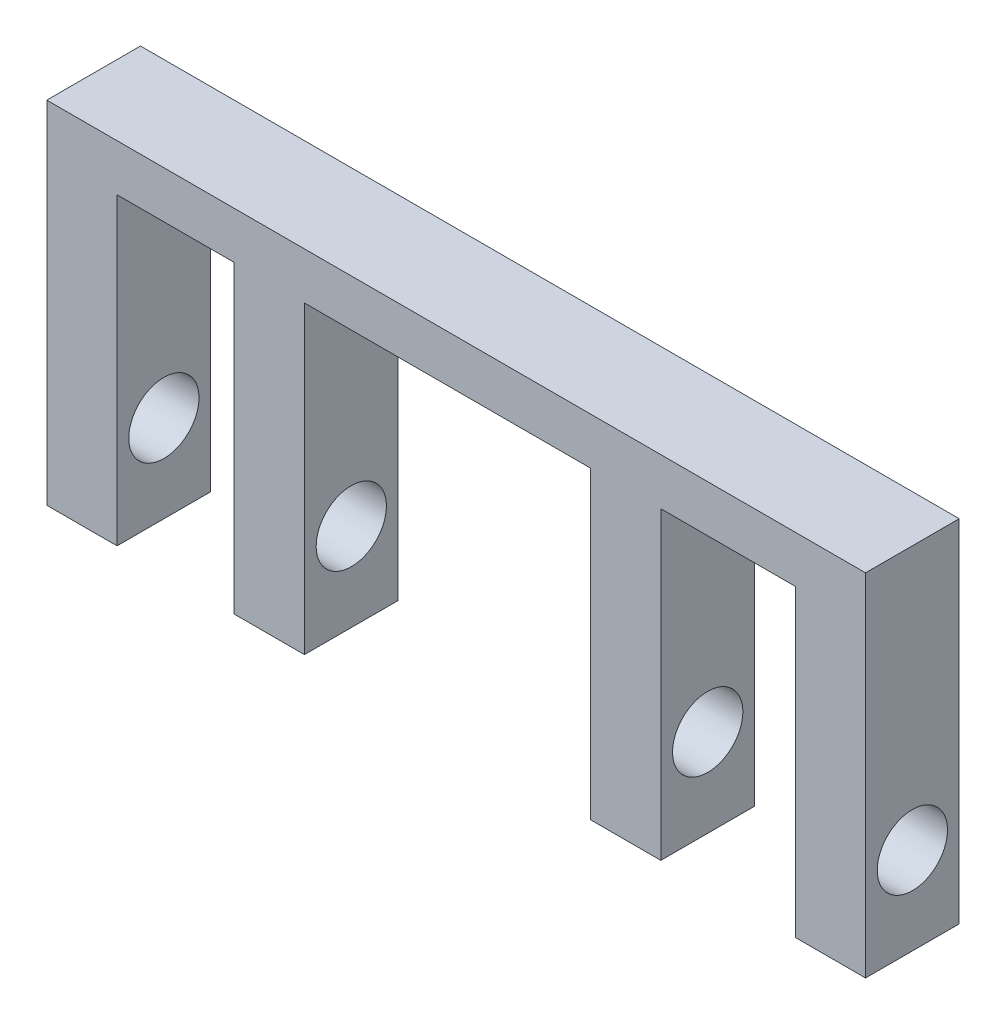
ISO-10303-21;
HEADER;
FILE_DESCRIPTION(('STEP AP214'),'2;1');
FILE_NAME('part.step','',(''),(''),'','','');
FILE_SCHEMA(('AUTOMOTIVE_DESIGN { 1 0 10303 214 1 1 1 1 }'));
ENDSEC;
DATA;
#1=APPLICATION_CONTEXT('core data for automotive mechanical design processes');
#2=APPLICATION_PROTOCOL_DEFINITION('international standard','automotive_design',2000,#1);
#3=PRODUCT_CONTEXT('',#1,'mechanical');
#4=PRODUCT('Part','Part','',(#3));
#5=PRODUCT_RELATED_PRODUCT_CATEGORY('part','',(#4));
#6=PRODUCT_DEFINITION_FORMATION('','',#4);
#7=PRODUCT_DEFINITION_CONTEXT('part definition',#1,'design');
#8=PRODUCT_DEFINITION('design','',#6,#7);
#9=PRODUCT_DEFINITION_SHAPE('','',#8);
#10=(LENGTH_UNIT() NAMED_UNIT(*) SI_UNIT(.MILLI.,.METRE.));
#11=(NAMED_UNIT(*) PLANE_ANGLE_UNIT() SI_UNIT($,.RADIAN.));
#12=(NAMED_UNIT(*) SI_UNIT($,.STERADIAN.) SOLID_ANGLE_UNIT());
#13=UNCERTAINTY_MEASURE_WITH_UNIT(LENGTH_MEASURE(1.E-05),#10,'distance_accuracy_value','');
#14=(GEOMETRIC_REPRESENTATION_CONTEXT(3) GLOBAL_UNCERTAINTY_ASSIGNED_CONTEXT((#13)) GLOBAL_UNIT_ASSIGNED_CONTEXT((#10,
#11,#12)) REPRESENTATION_CONTEXT('',''));
#15=CARTESIAN_POINT('',(0.,0.,0.));
#16=DIRECTION('',(0.,0.,1.));
#17=DIRECTION('',(1.,0.,0.));
#18=AXIS2_PLACEMENT_3D('',#15,#16,#17);
#19=CARTESIAN_POINT('',(0.,129.79,40.));
#20=DIRECTION('',(0.,1.,0.));
#21=DIRECTION('',(0.,0.,1.));
#22=AXIS2_PLACEMENT_3D('',#19,#20,#21);
#23=PLANE('',#22);
#24=DIRECTION('',(0.,0.,-1.));
#25=VECTOR('',#24,1.);
#26=CARTESIAN_POINT('',(232.128263463309,129.79,0.));
#27=LINE('',#26,#25);
#28=CARTESIAN_POINT('',(232.128263463309,129.79,40.));
#29=VERTEX_POINT('',#28);
#30=CARTESIAN_POINT('',(232.128263463309,129.79,0.));
#31=VERTEX_POINT('',#30);
#32=EDGE_CURVE('E63',#29,#31,#27,.T.);
#33=ORIENTED_EDGE('',*,*,#32,.F.);
#34=DIRECTION('',(1.,0.,0.));
#35=VECTOR('',#34,1.);
#36=CARTESIAN_POINT('',(0.,129.79,40.));
#37=LINE('',#36,#35);
#38=CARTESIAN_POINT('',(110.,129.79,40.));
#39=VERTEX_POINT('',#38);
#40=EDGE_CURVE('E176',#39,#29,#37,.T.);
#41=ORIENTED_EDGE('',*,*,#40,.F.);
#42=DIRECTION('',(0.,0.,-1.));
#43=VECTOR('',#42,1.);
#44=CARTESIAN_POINT('',(110.,129.79,0.));
#45=LINE('',#44,#43);
#46=CARTESIAN_POINT('',(110.,129.79,0.));
#47=VERTEX_POINT('',#46);
#48=EDGE_CURVE('E177',#39,#47,#45,.T.);
#49=ORIENTED_EDGE('',*,*,#48,.T.);
#50=DIRECTION('',(1.,0.,0.));
#51=VECTOR('',#50,1.);
#52=CARTESIAN_POINT('',(0.,129.79,0.));
#53=LINE('',#52,#51);
#54=EDGE_CURVE('E248',#47,#31,#53,.T.);
#55=ORIENTED_EDGE('',*,*,#54,.T.);
#56=EDGE_LOOP('',(#33,#41,#49,#55));
#57=FACE_BOUND('',#56,.T.);
#58=ADVANCED_FACE('F39',(#57),#23,.F.);
#59=DIRECTION('',(0.,0.,-1.));
#60=VECTOR('',#59,1.);
#61=CARTESIAN_POINT('',(80.,129.79,0.));
#62=LINE('',#61,#60);
#63=CARTESIAN_POINT('',(80.,129.79,40.));
#64=VERTEX_POINT('',#63);
#65=CARTESIAN_POINT('',(80.,129.79,0.));
#66=VERTEX_POINT('',#65);
#67=EDGE_CURVE('E180',#64,#66,#62,.T.);
#68=ORIENTED_EDGE('',*,*,#67,.F.);
#69=CARTESIAN_POINT('',(30.,129.79,40.));
#70=VERTEX_POINT('',#69);
#71=EDGE_CURVE('E226',#70,#64,#37,.T.);
#72=ORIENTED_EDGE('',*,*,#71,.F.);
#73=DIRECTION('',(0.,0.,-1.));
#74=VECTOR('',#73,1.);
#75=CARTESIAN_POINT('',(30.,129.79,40.));
#76=LINE('',#75,#74);
#77=CARTESIAN_POINT('',(30.,129.79,0.));
#78=VERTEX_POINT('',#77);
#79=EDGE_CURVE('E251',#70,#78,#76,.T.);
#80=ORIENTED_EDGE('',*,*,#79,.T.);
#81=EDGE_CURVE('E213',#78,#66,#53,.T.);
#82=ORIENTED_EDGE('',*,*,#81,.T.);
#83=EDGE_LOOP('',(#68,#72,#80,#82));
#84=FACE_BOUND('',#83,.T.);
#85=ADVANCED_FACE('F298',(#84),#23,.F.);
#86=CARTESIAN_POINT('',(319.51,0.,40.));
#87=DIRECTION('',(-1.,0.,0.));
#88=DIRECTION('',(0.,0.,1.));
#89=AXIS2_PLACEMENT_3D('',#86,#87,#88);
#90=PLANE('',#89);
#91=CARTESIAN_POINT('',(319.51,37.29,20.));
#92=DIRECTION('',(-1.,0.,0.));
#93=DIRECTION('',(0.,0.,1.));
#94=AXIS2_PLACEMENT_3D('',#91,#92,#93);
#95=CIRCLE('',#94,15.);
#96=CARTESIAN_POINT('',(319.51,37.29,35.));
#97=VERTEX_POINT('',#96);
#98=EDGE_CURVE('E351',#97,#97,#95,.T.);
#99=ORIENTED_EDGE('',*,*,#98,.F.);
#100=EDGE_LOOP('',(#99));
#101=FACE_BOUND('',#100,.T.);
#102=DIRECTION('',(0.,1.,0.));
#103=VECTOR('',#102,1.);
#104=CARTESIAN_POINT('',(319.51,0.,0.));
#105=LINE('',#104,#103);
#106=CARTESIAN_POINT('',(319.51,0.,0.));
#107=VERTEX_POINT('',#106);
#108=CARTESIAN_POINT('',(319.51,129.79,0.));
#109=VERTEX_POINT('',#108);
#110=EDGE_CURVE('E208',#107,#109,#105,.T.);
#111=ORIENTED_EDGE('',*,*,#110,.F.);
#112=DIRECTION('',(0.,0.,-1.));
#113=VECTOR('',#112,1.);
#114=CARTESIAN_POINT('',(319.51,0.,40.));
#115=LINE('',#114,#113);
#116=CARTESIAN_POINT('',(319.51,0.,40.));
#117=VERTEX_POINT('',#116);
#118=EDGE_CURVE('E11',#117,#107,#115,.T.);
#119=ORIENTED_EDGE('',*,*,#118,.F.);
#120=DIRECTION('',(0.,1.,0.));
#121=VECTOR('',#120,1.);
#122=CARTESIAN_POINT('',(319.51,0.,40.));
#123=LINE('',#122,#121);
#124=CARTESIAN_POINT('',(319.51,129.79,40.));
#125=VERTEX_POINT('',#124);
#126=EDGE_CURVE('E209',#117,#125,#123,.T.);
#127=ORIENTED_EDGE('',*,*,#126,.T.);
#128=DIRECTION('',(0.,0.,-1.));
#129=VECTOR('',#128,1.);
#130=CARTESIAN_POINT('',(319.51,129.79,40.));
#131=LINE('',#130,#129);
#132=EDGE_CURVE('E229',#125,#109,#131,.T.);
#133=ORIENTED_EDGE('',*,*,#132,.T.);
#134=EDGE_LOOP('',(#111,#119,#127,#133));
#135=FACE_BOUND('',#134,.T.);
#136=ADVANCED_FACE('F41',(#101,#135),#90,.T.);
#137=CARTESIAN_POINT('',(0.,0.,40.));
#138=DIRECTION('',(0.,1.,0.));
#139=DIRECTION('',(0.,0.,1.));
#140=AXIS2_PLACEMENT_3D('',#137,#138,#139);
#141=PLANE('',#140);
#142=DIRECTION('',(1.,0.,0.));
#143=VECTOR('',#142,1.);
#144=CARTESIAN_POINT('',(0.,0.,0.));
#145=LINE('',#144,#143);
#146=CARTESIAN_POINT('',(349.51,0.,0.));
#147=VERTEX_POINT('',#146);
#148=EDGE_CURVE('E232',#107,#147,#145,.T.);
#149=ORIENTED_EDGE('',*,*,#148,.T.);
#150=DIRECTION('',(0.,0.,-1.));
#151=VECTOR('',#150,1.);
#152=CARTESIAN_POINT('',(349.51,0.,40.));
#153=LINE('',#152,#151);
#154=CARTESIAN_POINT('',(349.51,0.,40.));
#155=VERTEX_POINT('',#154);
#156=EDGE_CURVE('E48',#155,#147,#153,.T.);
#157=ORIENTED_EDGE('',*,*,#156,.F.);
#158=DIRECTION('',(1.,0.,0.));
#159=VECTOR('',#158,1.);
#160=CARTESIAN_POINT('',(0.,0.,40.));
#161=LINE('',#160,#159);
#162=EDGE_CURVE('E212',#117,#155,#161,.T.);
#163=ORIENTED_EDGE('',*,*,#162,.F.);
#164=ORIENTED_EDGE('',*,*,#118,.T.);
#165=EDGE_LOOP('',(#149,#157,#163,#164));
#166=FACE_BOUND('',#165,.T.);
#167=ADVANCED_FACE('F316',(#166),#141,.F.);
#168=CARTESIAN_POINT('',(349.51,0.,40.));
#169=DIRECTION('',(-1.,0.,0.));
#170=DIRECTION('',(0.,0.,1.));
#171=AXIS2_PLACEMENT_3D('',#168,#169,#170);
#172=PLANE('',#171);
#173=CARTESIAN_POINT('',(349.51,37.29,20.));
#174=DIRECTION('',(-1.,0.,0.));
#175=DIRECTION('',(0.,0.,1.));
#176=AXIS2_PLACEMENT_3D('',#173,#174,#175);
#177=CIRCLE('',#176,15.);
#178=CARTESIAN_POINT('',(349.51,37.29,35.));
#179=VERTEX_POINT('',#178);
#180=EDGE_CURVE('E347',#179,#179,#177,.T.);
#181=ORIENTED_EDGE('',*,*,#180,.T.);
#182=EDGE_LOOP('',(#181));
#183=FACE_BOUND('',#182,.T.);
#184=DIRECTION('',(0.,1.,0.));
#185=VECTOR('',#184,1.);
#186=CARTESIAN_POINT('',(349.51,0.,0.));
#187=LINE('',#186,#185);
#188=CARTESIAN_POINT('',(349.51,149.79,0.));
#189=VERTEX_POINT('',#188);
#190=EDGE_CURVE('E234',#147,#189,#187,.T.);
#191=ORIENTED_EDGE('',*,*,#190,.T.);
#192=DIRECTION('',(0.,0.,-1.));
#193=VECTOR('',#192,1.);
#194=CARTESIAN_POINT('',(349.51,149.79,40.));
#195=LINE('',#194,#193);
#196=CARTESIAN_POINT('',(349.51,149.79,40.));
#197=VERTEX_POINT('',#196);
#198=EDGE_CURVE('E261',#197,#189,#195,.T.);
#199=ORIENTED_EDGE('',*,*,#198,.F.);
#200=DIRECTION('',(0.,1.,0.));
#201=VECTOR('',#200,1.);
#202=CARTESIAN_POINT('',(349.51,0.,40.));
#203=LINE('',#202,#201);
#204=EDGE_CURVE('E215',#155,#197,#203,.T.);
#205=ORIENTED_EDGE('',*,*,#204,.F.);
#206=ORIENTED_EDGE('',*,*,#156,.T.);
#207=EDGE_LOOP('',(#191,#199,#205,#206));
#208=FACE_BOUND('',#207,.T.);
#209=ADVANCED_FACE('F268',(#183,#208),#172,.F.);
#210=CARTESIAN_POINT('',(0.,149.79,40.));
#211=DIRECTION('',(0.,1.,0.));
#212=DIRECTION('',(0.,0.,1.));
#213=AXIS2_PLACEMENT_3D('',#210,#211,#212);
#214=PLANE('',#213);
#215=DIRECTION('',(1.,0.,0.));
#216=VECTOR('',#215,1.);
#217=CARTESIAN_POINT('',(0.,149.79,0.));
#218=LINE('',#217,#216);
#219=CARTESIAN_POINT('',(0.,149.79,0.));
#220=VERTEX_POINT('',#219);
#221=EDGE_CURVE('E238',#220,#189,#218,.T.);
#222=ORIENTED_EDGE('',*,*,#221,.F.);
#223=DIRECTION('',(0.,0.,-1.));
#224=VECTOR('',#223,1.);
#225=CARTESIAN_POINT('',(0.,149.79,40.));
#226=LINE('',#225,#224);
#227=CARTESIAN_POINT('',(0.,149.79,40.));
#228=VERTEX_POINT('',#227);
#229=EDGE_CURVE('E259',#228,#220,#226,.T.);
#230=ORIENTED_EDGE('',*,*,#229,.F.);
#231=DIRECTION('',(1.,0.,0.));
#232=VECTOR('',#231,1.);
#233=CARTESIAN_POINT('',(0.,149.79,40.));
#234=LINE('',#233,#232);
#235=EDGE_CURVE('E218',#228,#197,#234,.T.);
#236=ORIENTED_EDGE('',*,*,#235,.T.);
#237=ORIENTED_EDGE('',*,*,#198,.T.);
#238=EDGE_LOOP('',(#222,#230,#236,#237));
#239=FACE_BOUND('',#238,.T.);
#240=ADVANCED_FACE('F280',(#239),#214,.T.);
#241=CARTESIAN_POINT('',(0.,0.,40.));
#242=DIRECTION('',(-1.,0.,0.));
#243=DIRECTION('',(0.,0.,1.));
#244=AXIS2_PLACEMENT_3D('',#241,#242,#243);
#245=PLANE('',#244);
#246=CARTESIAN_POINT('',(0.,37.29,20.));
#247=DIRECTION('',(-1.,0.,0.));
#248=DIRECTION('',(0.,0.,1.));
#249=AXIS2_PLACEMENT_3D('',#246,#247,#248);
#250=CIRCLE('',#249,15.);
#251=CARTESIAN_POINT('',(0.,37.29,35.));
#252=VERTEX_POINT('',#251);
#253=EDGE_CURVE('E574',#252,#252,#250,.T.);
#254=ORIENTED_EDGE('',*,*,#253,.F.);
#255=EDGE_LOOP('',(#254));
#256=FACE_BOUND('',#255,.T.);
#257=DIRECTION('',(0.,1.,0.));
#258=VECTOR('',#257,1.);
#259=CARTESIAN_POINT('',(0.,0.,0.));
#260=LINE('',#259,#258);
#261=CARTESIAN_POINT('',(0.,0.,0.));
#262=VERTEX_POINT('',#261);
#263=EDGE_CURVE('E241',#262,#220,#260,.T.);
#264=ORIENTED_EDGE('',*,*,#263,.F.);
#265=DIRECTION('',(0.,0.,-1.));
#266=VECTOR('',#265,1.);
#267=CARTESIAN_POINT('',(0.,0.,40.));
#268=LINE('',#267,#266);
#269=CARTESIAN_POINT('',(0.,0.,40.));
#270=VERTEX_POINT('',#269);
#271=EDGE_CURVE('E257',#270,#262,#268,.T.);
#272=ORIENTED_EDGE('',*,*,#271,.F.);
#273=DIRECTION('',(0.,1.,0.));
#274=VECTOR('',#273,1.);
#275=CARTESIAN_POINT('',(0.,0.,40.));
#276=LINE('',#275,#274);
#277=EDGE_CURVE('E221',#270,#228,#276,.T.);
#278=ORIENTED_EDGE('',*,*,#277,.T.);
#279=ORIENTED_EDGE('',*,*,#229,.T.);
#280=EDGE_LOOP('',(#264,#272,#278,#279));
#281=FACE_BOUND('',#280,.T.);
#282=ADVANCED_FACE('F284',(#256,#281),#245,.T.);
#283=CARTESIAN_POINT('',(30.,0.,0.));
#284=VERTEX_POINT('',#283);
#285=EDGE_CURVE('E235',#262,#284,#145,.T.);
#286=ORIENTED_EDGE('',*,*,#285,.T.);
#287=DIRECTION('',(0.,0.,-1.));
#288=VECTOR('',#287,1.);
#289=CARTESIAN_POINT('',(30.,0.,40.));
#290=LINE('',#289,#288);
#291=CARTESIAN_POINT('',(30.,0.,40.));
#292=VERTEX_POINT('',#291);
#293=EDGE_CURVE('E254',#292,#284,#290,.T.);
#294=ORIENTED_EDGE('',*,*,#293,.F.);
#295=EDGE_CURVE('E216',#270,#292,#161,.T.);
#296=ORIENTED_EDGE('',*,*,#295,.F.);
#297=ORIENTED_EDGE('',*,*,#271,.T.);
#298=EDGE_LOOP('',(#286,#294,#296,#297));
#299=FACE_BOUND('',#298,.T.);
#300=ADVANCED_FACE('F288',(#299),#141,.F.);
#301=CARTESIAN_POINT('',(30.,0.,40.));
#302=DIRECTION('',(-1.,0.,0.));
#303=DIRECTION('',(0.,0.,1.));
#304=AXIS2_PLACEMENT_3D('',#301,#302,#303);
#305=PLANE('',#304);
#306=CARTESIAN_POINT('',(30.,37.29,20.));
#307=DIRECTION('',(-1.,0.,0.));
#308=DIRECTION('',(0.,0.,1.));
#309=AXIS2_PLACEMENT_3D('',#306,#307,#308);
#310=CIRCLE('',#309,15.);
#311=CARTESIAN_POINT('',(30.,37.29,35.));
#312=VERTEX_POINT('',#311);
#313=EDGE_CURVE('E345',#312,#312,#310,.T.);
#314=ORIENTED_EDGE('',*,*,#313,.T.);
#315=EDGE_LOOP('',(#314));
#316=FACE_BOUND('',#315,.T.);
#317=DIRECTION('',(0.,1.,0.));
#318=VECTOR('',#317,1.);
#319=CARTESIAN_POINT('',(30.,0.,0.));
#320=LINE('',#319,#318);
#321=EDGE_CURVE('E244',#284,#78,#320,.T.);
#322=ORIENTED_EDGE('',*,*,#321,.T.);
#323=ORIENTED_EDGE('',*,*,#79,.F.);
#324=DIRECTION('',(0.,1.,0.));
#325=VECTOR('',#324,1.);
#326=CARTESIAN_POINT('',(30.,0.,40.));
#327=LINE('',#326,#325);
#328=EDGE_CURVE('E224',#292,#70,#327,.T.);
#329=ORIENTED_EDGE('',*,*,#328,.F.);
#330=ORIENTED_EDGE('',*,*,#293,.T.);
#331=EDGE_LOOP('',(#322,#323,#329,#330));
#332=FACE_BOUND('',#331,.T.);
#333=ADVANCED_FACE('F294',(#316,#332),#305,.F.);
#334=CARTESIAN_POINT('',(262.128263463309,129.79,40.));
#335=VERTEX_POINT('',#334);
#336=EDGE_CURVE('E55',#335,#125,#37,.T.);
#337=ORIENTED_EDGE('',*,*,#336,.F.);
#338=DIRECTION('',(0.,0.,-1.));
#339=VECTOR('',#338,1.);
#340=CARTESIAN_POINT('',(262.128263463309,129.79,0.));
#341=LINE('',#340,#339);
#342=CARTESIAN_POINT('',(262.128263463309,129.79,0.));
#343=VERTEX_POINT('',#342);
#344=EDGE_CURVE('E171',#335,#343,#341,.T.);
#345=ORIENTED_EDGE('',*,*,#344,.T.);
#346=EDGE_CURVE('E246',#343,#109,#53,.T.);
#347=ORIENTED_EDGE('',*,*,#346,.T.);
#348=ORIENTED_EDGE('',*,*,#132,.F.);
#349=EDGE_LOOP('',(#337,#345,#347,#348));
#350=FACE_BOUND('',#349,.T.);
#351=ADVANCED_FACE('F314',(#350),#23,.F.);
#352=CARTESIAN_POINT('',(0.,0.,40.));
#353=DIRECTION('',(0.,0.,1.));
#354=DIRECTION('',(1.,0.,0.));
#355=AXIS2_PLACEMENT_3D('',#352,#353,#354);
#356=PLANE('',#355);
#357=ORIENTED_EDGE('',*,*,#126,.F.);
#358=ORIENTED_EDGE('',*,*,#162,.T.);
#359=ORIENTED_EDGE('',*,*,#204,.T.);
#360=ORIENTED_EDGE('',*,*,#235,.F.);
#361=ORIENTED_EDGE('',*,*,#277,.F.);
#362=ORIENTED_EDGE('',*,*,#295,.T.);
#363=ORIENTED_EDGE('',*,*,#328,.T.);
#364=ORIENTED_EDGE('',*,*,#71,.T.);
#365=DIRECTION('',(0.,1.,0.));
#366=VECTOR('',#365,1.);
#367=CARTESIAN_POINT('',(80.,-0.209999999999988,40.));
#368=LINE('',#367,#366);
#369=CARTESIAN_POINT('',(80.,-0.209999999999988,40.));
#370=VERTEX_POINT('',#369);
#371=EDGE_CURVE('E203',#370,#64,#368,.T.);
#372=ORIENTED_EDGE('',*,*,#371,.F.);
#373=DIRECTION('',(-1.,0.,0.));
#374=VECTOR('',#373,1.);
#375=CARTESIAN_POINT('',(0.,-0.209999999999988,40.));
#376=LINE('',#375,#374);
#377=CARTESIAN_POINT('',(110.,-0.209999999999988,40.));
#378=VERTEX_POINT('',#377);
#379=EDGE_CURVE('E189',#378,#370,#376,.T.);
#380=ORIENTED_EDGE('',*,*,#379,.F.);
#381=DIRECTION('',(0.,1.,0.));
#382=VECTOR('',#381,1.);
#383=CARTESIAN_POINT('',(110.,-0.209999999999988,40.));
#384=LINE('',#383,#382);
#385=EDGE_CURVE('E206',#378,#39,#384,.T.);
#386=ORIENTED_EDGE('',*,*,#385,.T.);
#387=ORIENTED_EDGE('',*,*,#40,.T.);
#388=DIRECTION('',(0.,1.,0.));
#389=VECTOR('',#388,1.);
#390=CARTESIAN_POINT('',(232.128263463309,-0.209999999999988,40.));
#391=LINE('',#390,#389);
#392=CARTESIAN_POINT('',(232.128263463309,-0.209999999999988,40.));
#393=VERTEX_POINT('',#392);
#394=EDGE_CURVE('E157',#393,#29,#391,.T.);
#395=ORIENTED_EDGE('',*,*,#394,.F.);
#396=DIRECTION('',(-1.,0.,0.));
#397=VECTOR('',#396,1.);
#398=CARTESIAN_POINT('',(0.,-0.209999999999988,40.));
#399=LINE('',#398,#397);
#400=CARTESIAN_POINT('',(262.128263463309,-0.209999999999988,40.));
#401=VERTEX_POINT('',#400);
#402=EDGE_CURVE('E163',#401,#393,#399,.T.);
#403=ORIENTED_EDGE('',*,*,#402,.F.);
#404=DIRECTION('',(0.,1.,0.));
#405=VECTOR('',#404,1.);
#406=CARTESIAN_POINT('',(262.128263463309,-0.209999999999988,40.));
#407=LINE('',#406,#405);
#408=EDGE_CURVE('E312',#401,#335,#407,.T.);
#409=ORIENTED_EDGE('',*,*,#408,.T.);
#410=ORIENTED_EDGE('',*,*,#336,.T.);
#411=EDGE_LOOP('',(#357,#358,#359,#360,#361,#362,#363,#364,#372,#380,#386,#387,#395,#403,#409,#410));
#412=FACE_BOUND('',#411,.T.);
#413=ADVANCED_FACE('F174',(#412),#356,.T.);
#414=CARTESIAN_POINT('',(0.,0.,0.));
#415=DIRECTION('',(0.,0.,1.));
#416=DIRECTION('',(1.,0.,0.));
#417=AXIS2_PLACEMENT_3D('',#414,#415,#416);
#418=PLANE('',#417);
#419=ORIENTED_EDGE('',*,*,#110,.T.);
#420=ORIENTED_EDGE('',*,*,#346,.F.);
#421=DIRECTION('',(0.,1.,0.));
#422=VECTOR('',#421,1.);
#423=CARTESIAN_POINT('',(262.128263463309,-0.209999999999988,0.));
#424=LINE('',#423,#422);
#425=CARTESIAN_POINT('',(262.128263463309,-0.209999999999988,0.));
#426=VERTEX_POINT('',#425);
#427=EDGE_CURVE('E182',#426,#343,#424,.T.);
#428=ORIENTED_EDGE('',*,*,#427,.F.);
#429=DIRECTION('',(1.,0.,0.));
#430=VECTOR('',#429,1.);
#431=CARTESIAN_POINT('',(0.,-0.209999999999988,0.));
#432=LINE('',#431,#430);
#433=CARTESIAN_POINT('',(232.128263463309,-0.209999999999988,0.));
#434=VERTEX_POINT('',#433);
#435=EDGE_CURVE('E162',#434,#426,#432,.T.);
#436=ORIENTED_EDGE('',*,*,#435,.F.);
#437=DIRECTION('',(0.,1.,0.));
#438=VECTOR('',#437,1.);
#439=CARTESIAN_POINT('',(232.128263463309,-0.209999999999988,0.));
#440=LINE('',#439,#438);
#441=EDGE_CURVE('E159',#434,#31,#440,.T.);
#442=ORIENTED_EDGE('',*,*,#441,.T.);
#443=ORIENTED_EDGE('',*,*,#54,.F.);
#444=DIRECTION('',(0.,1.,0.));
#445=VECTOR('',#444,1.);
#446=CARTESIAN_POINT('',(110.,-0.209999999999988,0.));
#447=LINE('',#446,#445);
#448=CARTESIAN_POINT('',(110.,-0.209999999999988,0.));
#449=VERTEX_POINT('',#448);
#450=EDGE_CURVE('E194',#449,#47,#447,.T.);
#451=ORIENTED_EDGE('',*,*,#450,.F.);
#452=DIRECTION('',(1.,0.,0.));
#453=VECTOR('',#452,1.);
#454=CARTESIAN_POINT('',(0.,-0.209999999999988,0.));
#455=LINE('',#454,#453);
#456=CARTESIAN_POINT('',(80.,-0.209999999999988,0.));
#457=VERTEX_POINT('',#456);
#458=EDGE_CURVE('E193',#457,#449,#455,.T.);
#459=ORIENTED_EDGE('',*,*,#458,.F.);
#460=DIRECTION('',(0.,1.,0.));
#461=VECTOR('',#460,1.);
#462=CARTESIAN_POINT('',(80.,-0.209999999999988,0.));
#463=LINE('',#462,#461);
#464=EDGE_CURVE('E200',#457,#66,#463,.T.);
#465=ORIENTED_EDGE('',*,*,#464,.T.);
#466=ORIENTED_EDGE('',*,*,#81,.F.);
#467=ORIENTED_EDGE('',*,*,#321,.F.);
#468=ORIENTED_EDGE('',*,*,#285,.F.);
#469=ORIENTED_EDGE('',*,*,#263,.T.);
#470=ORIENTED_EDGE('',*,*,#221,.T.);
#471=ORIENTED_EDGE('',*,*,#190,.F.);
#472=ORIENTED_EDGE('',*,*,#148,.F.);
#473=EDGE_LOOP('',(#419,#420,#428,#436,#442,#443,#451,#459,#465,#466,#467,#468,#469,#470,#471,#472));
#474=FACE_BOUND('',#473,.T.);
#475=ADVANCED_FACE('F274',(#474),#418,.F.);
#476=CARTESIAN_POINT('',(110.,-0.209999999999988,0.));
#477=DIRECTION('',(1.,0.,0.));
#478=DIRECTION('',(0.,0.,-1.));
#479=AXIS2_PLACEMENT_3D('',#476,#477,#478);
#480=PLANE('',#479);
#481=CARTESIAN_POINT('',(110.,37.29,20.));
#482=DIRECTION('',(1.,0.,0.));
#483=DIRECTION('',(0.,0.,-1.));
#484=AXIS2_PLACEMENT_3D('',#481,#482,#483);
#485=CIRCLE('',#484,15.);
#486=CARTESIAN_POINT('',(110.,37.29,35.));
#487=VERTEX_POINT('',#486);
#488=EDGE_CURVE('E348',#487,#487,#485,.T.);
#489=ORIENTED_EDGE('',*,*,#488,.F.);
#490=EDGE_LOOP('',(#489));
#491=FACE_BOUND('',#490,.T.);
#492=ORIENTED_EDGE('',*,*,#48,.F.);
#493=ORIENTED_EDGE('',*,*,#385,.F.);
#494=DIRECTION('',(0.,0.,-1.));
#495=VECTOR('',#494,1.);
#496=CARTESIAN_POINT('',(110.,-0.209999999999988,0.));
#497=LINE('',#496,#495);
#498=EDGE_CURVE('E186',#378,#449,#497,.T.);
#499=ORIENTED_EDGE('',*,*,#498,.T.);
#500=ORIENTED_EDGE('',*,*,#450,.T.);
#501=EDGE_LOOP('',(#492,#493,#499,#500));
#502=FACE_BOUND('',#501,.T.);
#503=ADVANCED_FACE('F311',(#491,#502),#480,.T.);
#504=CARTESIAN_POINT('',(80.,-0.209999999999988,0.));
#505=DIRECTION('',(1.,0.,0.));
#506=DIRECTION('',(0.,0.,-1.));
#507=AXIS2_PLACEMENT_3D('',#504,#505,#506);
#508=PLANE('',#507);
#509=CARTESIAN_POINT('',(80.,37.29,20.));
#510=DIRECTION('',(1.,0.,0.));
#511=DIRECTION('',(0.,0.,-1.));
#512=AXIS2_PLACEMENT_3D('',#509,#510,#511);
#513=CIRCLE('',#512,15.);
#514=CARTESIAN_POINT('',(80.,37.29,35.));
#515=VERTEX_POINT('',#514);
#516=EDGE_CURVE('E354',#515,#515,#513,.T.);
#517=ORIENTED_EDGE('',*,*,#516,.T.);
#518=EDGE_LOOP('',(#517));
#519=FACE_BOUND('',#518,.T.);
#520=ORIENTED_EDGE('',*,*,#67,.T.);
#521=ORIENTED_EDGE('',*,*,#464,.F.);
#522=DIRECTION('',(0.,0.,-1.));
#523=VECTOR('',#522,1.);
#524=CARTESIAN_POINT('',(80.,-0.209999999999988,0.));
#525=LINE('',#524,#523);
#526=EDGE_CURVE('E191',#370,#457,#525,.T.);
#527=ORIENTED_EDGE('',*,*,#526,.F.);
#528=ORIENTED_EDGE('',*,*,#371,.T.);
#529=EDGE_LOOP('',(#520,#521,#527,#528));
#530=FACE_BOUND('',#529,.T.);
#531=ADVANCED_FACE('F301',(#519,#530),#508,.F.);
#532=CARTESIAN_POINT('',(0.,-0.209999999999988,0.));
#533=DIRECTION('',(0.,-1.,0.));
#534=DIRECTION('',(0.,0.,-1.));
#535=AXIS2_PLACEMENT_3D('',#532,#533,#534);
#536=PLANE('',#535);
#537=ORIENTED_EDGE('',*,*,#498,.F.);
#538=ORIENTED_EDGE('',*,*,#379,.T.);
#539=ORIENTED_EDGE('',*,*,#526,.T.);
#540=ORIENTED_EDGE('',*,*,#458,.T.);
#541=EDGE_LOOP('',(#537,#538,#539,#540));
#542=FACE_BOUND('',#541,.T.);
#543=ADVANCED_FACE('F307',(#542),#536,.T.);
#544=CARTESIAN_POINT('',(232.128263463309,-0.209999999999988,0.));
#545=DIRECTION('',(1.,0.,0.));
#546=DIRECTION('',(0.,0.,-1.));
#547=AXIS2_PLACEMENT_3D('',#544,#545,#546);
#548=PLANE('',#547);
#549=CARTESIAN_POINT('',(232.128263463309,37.29,20.));
#550=DIRECTION('',(1.,0.,0.));
#551=DIRECTION('',(0.,0.,-1.));
#552=AXIS2_PLACEMENT_3D('',#549,#550,#551);
#553=CIRCLE('',#552,15.);
#554=CARTESIAN_POINT('',(232.128263463309,37.29,35.));
#555=VERTEX_POINT('',#554);
#556=EDGE_CURVE('E577',#555,#555,#553,.T.);
#557=ORIENTED_EDGE('',*,*,#556,.T.);
#558=EDGE_LOOP('',(#557));
#559=FACE_BOUND('',#558,.T.);
#560=ORIENTED_EDGE('',*,*,#32,.T.);
#561=ORIENTED_EDGE('',*,*,#441,.F.);
#562=DIRECTION('',(0.,0.,-1.));
#563=VECTOR('',#562,1.);
#564=CARTESIAN_POINT('',(232.128263463309,-0.209999999999988,0.));
#565=LINE('',#564,#563);
#566=EDGE_CURVE('E153',#393,#434,#565,.T.);
#567=ORIENTED_EDGE('',*,*,#566,.F.);
#568=ORIENTED_EDGE('',*,*,#394,.T.);
#569=EDGE_LOOP('',(#560,#561,#567,#568));
#570=FACE_BOUND('',#569,.T.);
#571=ADVANCED_FACE('F155',(#559,#570),#548,.F.);
#572=CARTESIAN_POINT('',(262.128263463309,-0.209999999999988,0.));
#573=DIRECTION('',(1.,0.,0.));
#574=DIRECTION('',(0.,0.,-1.));
#575=AXIS2_PLACEMENT_3D('',#572,#573,#574);
#576=PLANE('',#575);
#577=CARTESIAN_POINT('',(262.128263463309,37.29,20.));
#578=DIRECTION('',(1.,0.,0.));
#579=DIRECTION('',(0.,0.,-1.));
#580=AXIS2_PLACEMENT_3D('',#577,#578,#579);
#581=CIRCLE('',#580,15.);
#582=CARTESIAN_POINT('',(262.128263463309,37.29,35.));
#583=VERTEX_POINT('',#582);
#584=EDGE_CURVE('E43',#583,#583,#581,.T.);
#585=ORIENTED_EDGE('',*,*,#584,.F.);
#586=EDGE_LOOP('',(#585));
#587=FACE_BOUND('',#586,.T.);
#588=ORIENTED_EDGE('',*,*,#344,.F.);
#589=ORIENTED_EDGE('',*,*,#408,.F.);
#590=DIRECTION('',(0.,0.,-1.));
#591=VECTOR('',#590,1.);
#592=CARTESIAN_POINT('',(262.128263463309,-0.209999999999988,0.));
#593=LINE('',#592,#591);
#594=EDGE_CURVE('E169',#401,#426,#593,.T.);
#595=ORIENTED_EDGE('',*,*,#594,.T.);
#596=ORIENTED_EDGE('',*,*,#427,.T.);
#597=EDGE_LOOP('',(#588,#589,#595,#596));
#598=FACE_BOUND('',#597,.T.);
#599=ADVANCED_FACE('F367',(#587,#598),#576,.T.);
#600=CARTESIAN_POINT('',(0.,-0.209999999999988,0.));
#601=DIRECTION('',(0.,-1.,0.));
#602=DIRECTION('',(0.,0.,-1.));
#603=AXIS2_PLACEMENT_3D('',#600,#601,#602);
#604=PLANE('',#603);
#605=ORIENTED_EDGE('',*,*,#402,.T.);
#606=ORIENTED_EDGE('',*,*,#566,.T.);
#607=ORIENTED_EDGE('',*,*,#435,.T.);
#608=ORIENTED_EDGE('',*,*,#594,.F.);
#609=EDGE_LOOP('',(#605,#606,#607,#608));
#610=FACE_BOUND('',#609,.T.);
#611=ADVANCED_FACE('F167',(#610),#604,.T.);
#612=CARTESIAN_POINT('',(410.,37.29,20.));
#613=DIRECTION('',(-1.,0.,0.));
#614=DIRECTION('',(0.,0.,1.));
#615=AXIS2_PLACEMENT_3D('',#612,#613,#614);
#616=CYLINDRICAL_SURFACE('',#615,15.);
#617=CARTESIAN_POINT('',(262.128263463309,37.29,35.));
#618=CARTESIAN_POINT('',(261.815763463309,37.29,35.));
#619=CARTESIAN_POINT('',(261.503263463308,37.29,35.));
#620=CARTESIAN_POINT('',(260.878263463308,37.29,35.));
#621=CARTESIAN_POINT('',(260.565763463308,37.29,35.));
#622=CARTESIAN_POINT('',(259.940763463309,37.29,35.));
#623=CARTESIAN_POINT('',(259.628263463309,37.29,35.));
#624=CARTESIAN_POINT('',(259.003263463309,37.29,35.));
#625=CARTESIAN_POINT('',(258.690763463308,37.29,35.));
#626=CARTESIAN_POINT('',(258.065763463308,37.29,35.));
#627=CARTESIAN_POINT('',(257.753263463308,37.29,35.));
#628=CARTESIAN_POINT('',(257.128263463309,37.29,35.));
#629=CARTESIAN_POINT('',(256.815763463309,37.29,35.));
#630=CARTESIAN_POINT('',(256.190763463309,37.29,35.));
#631=CARTESIAN_POINT('',(255.878263463308,37.29,35.));
#632=CARTESIAN_POINT('',(255.253263463309,37.29,35.));
#633=CARTESIAN_POINT('',(254.940763463308,37.29,35.));
#634=CARTESIAN_POINT('',(254.315763463308,37.29,35.));
#635=CARTESIAN_POINT('',(254.003263463309,37.29,35.));
#636=CARTESIAN_POINT('',(253.378263463309,37.29,35.));
#637=CARTESIAN_POINT('',(253.065763463309,37.29,35.));
#638=CARTESIAN_POINT('',(252.440763463309,37.29,35.));
#639=CARTESIAN_POINT('',(252.128263463308,37.29,35.));
#640=CARTESIAN_POINT('',(251.503263463308,37.29,35.));
#641=CARTESIAN_POINT('',(251.190763463309,37.29,35.));
#642=CARTESIAN_POINT('',(250.565763463309,37.29,35.));
#643=CARTESIAN_POINT('',(250.253263463309,37.29,35.));
#644=CARTESIAN_POINT('',(249.628263463309,37.29,35.));
#645=CARTESIAN_POINT('',(249.315763463308,37.29,35.));
#646=CARTESIAN_POINT('',(248.690763463309,37.29,35.));
#647=CARTESIAN_POINT('',(248.378263463309,37.29,35.));
#648=CARTESIAN_POINT('',(247.753263463309,37.29,35.));
#649=CARTESIAN_POINT('',(247.440763463309,37.29,35.));
#650=CARTESIAN_POINT('',(246.815763463309,37.29,35.));
#651=CARTESIAN_POINT('',(246.503263463309,37.29,35.));
#652=CARTESIAN_POINT('',(245.878263463309,37.29,35.));
#653=CARTESIAN_POINT('',(245.565763463309,37.29,35.));
#654=CARTESIAN_POINT('',(244.940763463309,37.29,35.));
#655=CARTESIAN_POINT('',(244.628263463309,37.29,35.));
#656=CARTESIAN_POINT('',(244.003263463309,37.29,35.));
#657=CARTESIAN_POINT('',(243.690763463309,37.29,35.));
#658=CARTESIAN_POINT('',(243.065763463309,37.29,35.));
#659=CARTESIAN_POINT('',(242.753263463309,37.29,35.));
#660=CARTESIAN_POINT('',(242.128263463309,37.29,35.));
#661=CARTESIAN_POINT('',(241.815763463309,37.29,35.));
#662=CARTESIAN_POINT('',(241.190763463309,37.29,35.));
#663=CARTESIAN_POINT('',(240.878263463309,37.29,35.));
#664=CARTESIAN_POINT('',(240.253263463309,37.29,35.));
#665=CARTESIAN_POINT('',(239.940763463309,37.29,35.));
#666=CARTESIAN_POINT('',(239.315763463309,37.29,35.));
#667=CARTESIAN_POINT('',(239.003263463309,37.29,35.));
#668=CARTESIAN_POINT('',(238.378263463309,37.29,35.));
#669=CARTESIAN_POINT('',(238.065763463309,37.29,35.));
#670=CARTESIAN_POINT('',(237.440763463309,37.29,35.));
#671=CARTESIAN_POINT('',(237.128263463309,37.29,35.));
#672=CARTESIAN_POINT('',(236.503263463309,37.29,35.));
#673=CARTESIAN_POINT('',(236.190763463309,37.29,35.));
#674=CARTESIAN_POINT('',(235.565763463309,37.29,35.));
#675=CARTESIAN_POINT('',(235.253263463309,37.29,35.));
#676=CARTESIAN_POINT('',(234.628263463309,37.29,35.));
#677=CARTESIAN_POINT('',(234.315763463309,37.29,35.));
#678=CARTESIAN_POINT('',(233.690763463309,37.29,35.));
#679=CARTESIAN_POINT('',(233.378263463309,37.29,35.));
#680=CARTESIAN_POINT('',(232.753263463309,37.29,35.));
#681=CARTESIAN_POINT('',(232.440763463309,37.29,35.));
#682=CARTESIAN_POINT('',(232.128263463309,37.29,35.));
#683=B_SPLINE_CURVE_WITH_KNOTS('',3,(#617,#618,#619,#620,#621,#622,#623,#624,#625,#626,#627,
#628,#629,#630,#631,#632,#633,#634,#635,#636,#637,#638,#639,#640,#641,#642,#643,#644,#645,#646,
#647,#648,#649,#650,#651,#652,#653,#654,#655,#656,#657,#658,#659,#660,#661,#662,#663,#664,#665,
#666,#667,#668,#669,#670,#671,#672,#673,#674,#675,#676,#677,#678,#679,#680,#681,#682),
.UNSPECIFIED.,.F.,.F.,(4,2,2,2,2,2,2,2,2,2,2,2,2,2,2,2,2,2,2,2,2,2,2,2,2,2,2,2,2,2,2,2,4),(0.,
0.937500000000036,1.87500000000002,2.8125,3.75000000000003,4.68750000000001,5.62499999999999,
6.56250000000003,7.50000000000006,8.43749999999999,9.37500000000002,10.3125000000001,11.25,
12.1875,13.125,14.0625,15.,15.9375,16.875,17.8125,18.75,19.6875,20.625,21.5625,22.5,23.4375,
24.375,25.3125,26.25,27.1875,28.125,29.0625,30.),.UNSPECIFIED.);
#684=EDGE_CURVE('BSEAM375',#583,#555,#683,.T.);
#685=ORIENTED_EDGE('',*,*,#584,.T.);
#686=ORIENTED_EDGE('',*,*,#556,.F.);
#687=ORIENTED_EDGE('',*,*,#684,.T.);
#688=ORIENTED_EDGE('',*,*,#684,.F.);
#689=EDGE_LOOP('',(#685,#687,#686,#688));
#690=FACE_BOUND('',#689,.T.);
#691=ADVANCED_FACE('F375',(#690),#616,.F.);
#692=CARTESIAN_POINT('',(110.,37.29,35.));
#693=CARTESIAN_POINT('',(109.6875,37.29,35.));
#694=CARTESIAN_POINT('',(109.375,37.29,35.));
#695=CARTESIAN_POINT('',(108.75,37.29,35.));
#696=CARTESIAN_POINT('',(108.4375,37.29,35.));
#697=CARTESIAN_POINT('',(107.8125,37.29,35.));
#698=CARTESIAN_POINT('',(107.5,37.29,35.));
#699=CARTESIAN_POINT('',(106.875,37.29,35.));
#700=CARTESIAN_POINT('',(106.5625,37.29,35.));
#701=CARTESIAN_POINT('',(105.9375,37.29,35.));
#702=CARTESIAN_POINT('',(105.625,37.29,35.));
#703=CARTESIAN_POINT('',(105.,37.29,35.));
#704=CARTESIAN_POINT('',(104.6875,37.29,35.));
#705=CARTESIAN_POINT('',(104.0625,37.29,35.));
#706=CARTESIAN_POINT('',(103.75,37.29,35.));
#707=CARTESIAN_POINT('',(103.125,37.29,35.));
#708=CARTESIAN_POINT('',(102.8125,37.29,35.));
#709=CARTESIAN_POINT('',(102.1875,37.29,35.));
#710=CARTESIAN_POINT('',(101.875,37.29,35.));
#711=CARTESIAN_POINT('',(101.25,37.29,35.));
#712=CARTESIAN_POINT('',(100.9375,37.29,35.));
#713=CARTESIAN_POINT('',(100.3125,37.29,35.));
#714=CARTESIAN_POINT('',(100.,37.29,35.));
#715=CARTESIAN_POINT('',(99.375,37.29,35.));
#716=CARTESIAN_POINT('',(99.0625,37.29,35.));
#717=CARTESIAN_POINT('',(98.4375,37.29,35.));
#718=CARTESIAN_POINT('',(98.125,37.29,35.));
#719=CARTESIAN_POINT('',(97.5,37.29,35.));
#720=CARTESIAN_POINT('',(97.1875,37.29,35.));
#721=CARTESIAN_POINT('',(96.5625,37.29,35.));
#722=CARTESIAN_POINT('',(96.25,37.29,35.));
#723=CARTESIAN_POINT('',(95.625,37.29,35.));
#724=CARTESIAN_POINT('',(95.3125,37.29,35.));
#725=CARTESIAN_POINT('',(94.6875,37.29,35.));
#726=CARTESIAN_POINT('',(94.375,37.29,35.));
#727=CARTESIAN_POINT('',(93.75,37.29,35.));
#728=CARTESIAN_POINT('',(93.4375,37.29,35.));
#729=CARTESIAN_POINT('',(92.8125,37.29,35.));
#730=CARTESIAN_POINT('',(92.5,37.29,35.));
#731=CARTESIAN_POINT('',(91.875,37.29,35.));
#732=CARTESIAN_POINT('',(91.5624999999999,37.29,35.));
#733=CARTESIAN_POINT('',(90.9374999999999,37.29,35.));
#734=CARTESIAN_POINT('',(90.625,37.29,35.));
#735=CARTESIAN_POINT('',(90.,37.29,35.));
#736=CARTESIAN_POINT('',(89.6875,37.29,35.));
#737=CARTESIAN_POINT('',(89.0625,37.29,35.));
#738=CARTESIAN_POINT('',(88.75,37.29,35.));
#739=CARTESIAN_POINT('',(88.125,37.29,35.));
#740=CARTESIAN_POINT('',(87.8125,37.29,35.));
#741=CARTESIAN_POINT('',(87.1875,37.29,35.));
#742=CARTESIAN_POINT('',(86.875,37.29,35.));
#743=CARTESIAN_POINT('',(86.25,37.29,35.));
#744=CARTESIAN_POINT('',(85.9375,37.29,35.));
#745=CARTESIAN_POINT('',(85.3125,37.29,35.));
#746=CARTESIAN_POINT('',(85.,37.29,35.));
#747=CARTESIAN_POINT('',(84.375,37.29,35.));
#748=CARTESIAN_POINT('',(84.0625,37.29,35.));
#749=CARTESIAN_POINT('',(83.4375,37.29,35.));
#750=CARTESIAN_POINT('',(83.125,37.29,35.));
#751=CARTESIAN_POINT('',(82.5,37.29,35.));
#752=CARTESIAN_POINT('',(82.1875,37.29,35.));
#753=CARTESIAN_POINT('',(81.5625,37.29,35.));
#754=CARTESIAN_POINT('',(81.2499999999999,37.29,35.));
#755=CARTESIAN_POINT('',(80.6249999999999,37.29,35.));
#756=CARTESIAN_POINT('',(80.3125,37.29,35.));
#757=CARTESIAN_POINT('',(80.,37.29,35.));
#758=B_SPLINE_CURVE_WITH_KNOTS('',3,(#692,#693,#694,#695,#696,#697,#698,#699,#700,#701,#702,
#703,#704,#705,#706,#707,#708,#709,#710,#711,#712,#713,#714,#715,#716,#717,#718,#719,#720,#721,
#722,#723,#724,#725,#726,#727,#728,#729,#730,#731,#732,#733,#734,#735,#736,#737,#738,#739,#740,
#741,#742,#743,#744,#745,#746,#747,#748,#749,#750,#751,#752,#753,#754,#755,#756,#757),
.UNSPECIFIED.,.F.,.F.,(4,2,2,2,2,2,2,2,2,2,2,2,2,2,2,2,2,2,2,2,2,2,2,2,2,2,2,2,2,2,2,2,4),(0.,
0.93749999999998,1.87500000000002,2.8125,3.75000000000003,4.68750000000001,5.62499999999999,
6.56250000000003,7.50000000000001,8.43749999999999,9.37500000000002,10.3125,11.25,12.1875,
13.125,14.0625,15.,15.9375,16.875,17.8125,18.75,19.6875,20.625,21.5625,22.5,23.4375,24.375,
25.3125,26.25,27.1875,28.125,29.0625,30.),.UNSPECIFIED.);
#759=EDGE_CURVE('BSEAM427',#487,#515,#758,.T.);
#760=ORIENTED_EDGE('',*,*,#488,.T.);
#761=ORIENTED_EDGE('',*,*,#516,.F.);
#762=ORIENTED_EDGE('',*,*,#759,.T.);
#763=ORIENTED_EDGE('',*,*,#759,.F.);
#764=EDGE_LOOP('',(#760,#762,#761,#763));
#765=FACE_BOUND('',#764,.T.);
#766=ADVANCED_FACE('F427',(#765),#616,.F.);
#767=CARTESIAN_POINT('',(0.,37.29,35.));
#768=CARTESIAN_POINT('',(0.312499999999993,37.29,35.));
#769=CARTESIAN_POINT('',(0.624999999999987,37.29,35.));
#770=CARTESIAN_POINT('',(1.24999999999999,37.29,35.));
#771=CARTESIAN_POINT('',(1.5625,37.29,35.));
#772=CARTESIAN_POINT('',(2.18750000000001,37.29,35.));
#773=CARTESIAN_POINT('',(2.5,37.29,35.));
#774=CARTESIAN_POINT('',(3.12500000000001,37.29,35.));
#775=CARTESIAN_POINT('',(3.43750000000002,37.29,35.));
#776=CARTESIAN_POINT('',(4.06250000000002,37.29,35.));
#777=CARTESIAN_POINT('',(4.37500000000002,37.29,35.));
#778=CARTESIAN_POINT('',(5.,37.29,35.));
#779=CARTESIAN_POINT('',(5.3125,37.29,35.));
#780=CARTESIAN_POINT('',(5.9375,37.29,35.));
#781=CARTESIAN_POINT('',(6.25000000000002,37.29,35.));
#782=CARTESIAN_POINT('',(6.87500000000002,37.29,35.));
#783=CARTESIAN_POINT('',(7.18750000000001,37.29,35.));
#784=CARTESIAN_POINT('',(7.8125,37.29,35.));
#785=CARTESIAN_POINT('',(8.12499999999999,37.29,35.));
#786=CARTESIAN_POINT('',(8.75,37.29,35.));
#787=CARTESIAN_POINT('',(9.06250000000001,37.29,35.));
#788=CARTESIAN_POINT('',(9.68750000000002,37.29,35.));
#789=CARTESIAN_POINT('',(10.,37.29,35.));
#790=CARTESIAN_POINT('',(10.625,37.29,35.));
#791=CARTESIAN_POINT('',(10.9375,37.29,35.));
#792=CARTESIAN_POINT('',(11.5625,37.29,35.));
#793=CARTESIAN_POINT('',(11.875,37.29,35.));
#794=CARTESIAN_POINT('',(12.5,37.29,35.));
#795=CARTESIAN_POINT('',(12.8125,37.29,35.));
#796=CARTESIAN_POINT('',(13.4375,37.29,35.));
#797=CARTESIAN_POINT('',(13.75,37.29,35.));
#798=CARTESIAN_POINT('',(14.375,37.29,35.));
#799=CARTESIAN_POINT('',(14.6875,37.29,35.));
#800=CARTESIAN_POINT('',(15.3125,37.29,35.));
#801=CARTESIAN_POINT('',(15.625,37.29,35.));
#802=CARTESIAN_POINT('',(16.25,37.29,35.));
#803=CARTESIAN_POINT('',(16.5625,37.29,35.));
#804=CARTESIAN_POINT('',(17.1875,37.29,35.));
#805=CARTESIAN_POINT('',(17.5,37.29,35.));
#806=CARTESIAN_POINT('',(18.125,37.29,35.));
#807=CARTESIAN_POINT('',(18.4375,37.29,35.));
#808=CARTESIAN_POINT('',(19.0625,37.29,35.));
#809=CARTESIAN_POINT('',(19.375,37.29,35.));
#810=CARTESIAN_POINT('',(20.,37.29,35.));
#811=CARTESIAN_POINT('',(20.3125,37.29,35.));
#812=CARTESIAN_POINT('',(20.9375,37.29,35.));
#813=CARTESIAN_POINT('',(21.25,37.29,35.));
#814=CARTESIAN_POINT('',(21.875,37.29,35.));
#815=CARTESIAN_POINT('',(22.1875,37.29,35.));
#816=CARTESIAN_POINT('',(22.8125,37.29,35.));
#817=CARTESIAN_POINT('',(23.125,37.29,35.));
#818=CARTESIAN_POINT('',(23.75,37.29,35.));
#819=CARTESIAN_POINT('',(24.0625,37.29,35.));
#820=CARTESIAN_POINT('',(24.6875,37.29,35.));
#821=CARTESIAN_POINT('',(25.,37.29,35.));
#822=CARTESIAN_POINT('',(25.625,37.29,35.));
#823=CARTESIAN_POINT('',(25.9375,37.29,35.));
#824=CARTESIAN_POINT('',(26.5625,37.29,35.));
#825=CARTESIAN_POINT('',(26.875,37.29,35.));
#826=CARTESIAN_POINT('',(27.5,37.29,35.));
#827=CARTESIAN_POINT('',(27.8125,37.29,35.));
#828=CARTESIAN_POINT('',(28.4375,37.29,35.));
#829=CARTESIAN_POINT('',(28.75,37.29,35.));
#830=CARTESIAN_POINT('',(29.375,37.29,35.));
#831=CARTESIAN_POINT('',(29.6875,37.29,35.));
#832=CARTESIAN_POINT('',(30.,37.29,35.));
#833=B_SPLINE_CURVE_WITH_KNOTS('',3,(#767,#768,#769,#770,#771,#772,#773,#774,#775,#776,#777,
#778,#779,#780,#781,#782,#783,#784,#785,#786,#787,#788,#789,#790,#791,#792,#793,#794,#795,#796,
#797,#798,#799,#800,#801,#802,#803,#804,#805,#806,#807,#808,#809,#810,#811,#812,#813,#814,#815,
#816,#817,#818,#819,#820,#821,#822,#823,#824,#825,#826,#827,#828,#829,#830,#831,#832),
.UNSPECIFIED.,.F.,.F.,(4,2,2,2,2,2,2,2,2,2,2,2,2,2,2,2,2,2,2,2,2,2,2,2,2,2,2,2,2,2,2,2,4),(0.,
0.93749999999998,1.87500000000002,2.8125,3.75000000000003,4.68750000000001,5.62499999999999,
6.56250000000003,7.50000000000001,8.43749999999999,9.37500000000002,10.3125,11.25,12.1875,
13.125,14.0625,15.,15.9375,16.875,17.8125,18.75,19.6875,20.625,21.5625,22.5,23.4375,24.375,
25.3125,26.25,27.1875,28.125,29.0625,30.),.UNSPECIFIED.);
#834=EDGE_CURVE('BSEAM438',#252,#312,#833,.T.);
#835=ORIENTED_EDGE('',*,*,#253,.T.);
#836=ORIENTED_EDGE('',*,*,#313,.F.);
#837=ORIENTED_EDGE('',*,*,#834,.T.);
#838=ORIENTED_EDGE('',*,*,#834,.F.);
#839=EDGE_LOOP('',(#835,#837,#836,#838));
#840=FACE_BOUND('',#839,.T.);
#841=ADVANCED_FACE('F438',(#840),#616,.F.);
#842=CARTESIAN_POINT('',(319.51,37.29,35.));
#843=CARTESIAN_POINT('',(319.8225,37.29,35.));
#844=CARTESIAN_POINT('',(320.135,37.29,35.));
#845=CARTESIAN_POINT('',(320.76,37.29,35.));
#846=CARTESIAN_POINT('',(321.0725,37.29,35.));
#847=CARTESIAN_POINT('',(321.6975,37.29,35.));
#848=CARTESIAN_POINT('',(322.01,37.29,35.));
#849=CARTESIAN_POINT('',(322.635,37.29,35.));
#850=CARTESIAN_POINT('',(322.9475,37.29,35.));
#851=CARTESIAN_POINT('',(323.5725,37.29,35.));
#852=CARTESIAN_POINT('',(323.885,37.29,35.));
#853=CARTESIAN_POINT('',(324.51,37.29,35.));
#854=CARTESIAN_POINT('',(324.8225,37.29,35.));
#855=CARTESIAN_POINT('',(325.4475,37.29,35.));
#856=CARTESIAN_POINT('',(325.76,37.29,35.));
#857=CARTESIAN_POINT('',(326.385,37.29,35.));
#858=CARTESIAN_POINT('',(326.6975,37.29,35.));
#859=CARTESIAN_POINT('',(327.3225,37.29,35.));
#860=CARTESIAN_POINT('',(327.635,37.29,35.));
#861=CARTESIAN_POINT('',(328.26,37.29,35.));
#862=CARTESIAN_POINT('',(328.5725,37.29,35.));
#863=CARTESIAN_POINT('',(329.1975,37.29,35.));
#864=CARTESIAN_POINT('',(329.51,37.29,35.));
#865=CARTESIAN_POINT('',(330.135,37.29,35.));
#866=CARTESIAN_POINT('',(330.4475,37.29,35.));
#867=CARTESIAN_POINT('',(331.0725,37.29,35.));
#868=CARTESIAN_POINT('',(331.385,37.29,35.));
#869=CARTESIAN_POINT('',(332.01,37.29,35.));
#870=CARTESIAN_POINT('',(332.3225,37.29,35.));
#871=CARTESIAN_POINT('',(332.9475,37.29,35.));
#872=CARTESIAN_POINT('',(333.26,37.29,35.));
#873=CARTESIAN_POINT('',(333.885,37.29,35.));
#874=CARTESIAN_POINT('',(334.1975,37.29,35.));
#875=CARTESIAN_POINT('',(334.8225,37.29,35.));
#876=CARTESIAN_POINT('',(335.135,37.29,35.));
#877=CARTESIAN_POINT('',(335.76,37.29,35.));
#878=CARTESIAN_POINT('',(336.0725,37.29,35.));
#879=CARTESIAN_POINT('',(336.6975,37.29,35.));
#880=CARTESIAN_POINT('',(337.01,37.29,35.));
#881=CARTESIAN_POINT('',(337.635,37.29,35.));
#882=CARTESIAN_POINT('',(337.9475,37.29,35.));
#883=CARTESIAN_POINT('',(338.5725,37.29,35.));
#884=CARTESIAN_POINT('',(338.885,37.29,35.));
#885=CARTESIAN_POINT('',(339.51,37.29,35.));
#886=CARTESIAN_POINT('',(339.8225,37.29,35.));
#887=CARTESIAN_POINT('',(340.4475,37.29,35.));
#888=CARTESIAN_POINT('',(340.76,37.29,35.));
#889=CARTESIAN_POINT('',(341.385,37.29,35.));
#890=CARTESIAN_POINT('',(341.6975,37.29,35.));
#891=CARTESIAN_POINT('',(342.3225,37.29,35.));
#892=CARTESIAN_POINT('',(342.635,37.29,35.));
#893=CARTESIAN_POINT('',(343.26,37.29,35.));
#894=CARTESIAN_POINT('',(343.5725,37.29,35.));
#895=CARTESIAN_POINT('',(344.1975,37.29,35.));
#896=CARTESIAN_POINT('',(344.51,37.29,35.));
#897=CARTESIAN_POINT('',(345.135,37.29,35.));
#898=CARTESIAN_POINT('',(345.4475,37.29,35.));
#899=CARTESIAN_POINT('',(346.0725,37.29,35.));
#900=CARTESIAN_POINT('',(346.385,37.29,35.));
#901=CARTESIAN_POINT('',(347.01,37.29,35.));
#902=CARTESIAN_POINT('',(347.3225,37.29,35.));
#903=CARTESIAN_POINT('',(347.9475,37.29,35.));
#904=CARTESIAN_POINT('',(348.26,37.29,35.));
#905=CARTESIAN_POINT('',(348.885,37.29,35.));
#906=CARTESIAN_POINT('',(349.1975,37.29,35.));
#907=CARTESIAN_POINT('',(349.51,37.29,35.));
#908=B_SPLINE_CURVE_WITH_KNOTS('',3,(#842,#843,#844,#845,#846,#847,#848,#849,#850,#851,#852,
#853,#854,#855,#856,#857,#858,#859,#860,#861,#862,#863,#864,#865,#866,#867,#868,#869,#870,#871,
#872,#873,#874,#875,#876,#877,#878,#879,#880,#881,#882,#883,#884,#885,#886,#887,#888,#889,#890,
#891,#892,#893,#894,#895,#896,#897,#898,#899,#900,#901,#902,#903,#904,#905,#906,#907),
.UNSPECIFIED.,.F.,.F.,(4,2,2,2,2,2,2,2,2,2,2,2,2,2,2,2,2,2,2,2,2,2,2,2,2,2,2,2,2,2,2,2,4),(0.,
0.93749999999998,1.87500000000002,2.8125,3.74999999999998,4.68750000000001,5.62499999999999,
6.56249999999997,7.50000000000001,8.43749999999999,9.37499999999997,10.3125,11.25,12.1875,
13.125,14.0625,15.,15.9375,16.875,17.8125,18.75,19.6875,20.625,21.5625,22.5,23.4375,24.375,
25.3125,26.25,27.1875,28.125,29.0625,30.),.UNSPECIFIED.);
#909=EDGE_CURVE('BSEAM429',#97,#179,#908,.T.);
#910=ORIENTED_EDGE('',*,*,#98,.T.);
#911=ORIENTED_EDGE('',*,*,#180,.F.);
#912=ORIENTED_EDGE('',*,*,#909,.T.);
#913=ORIENTED_EDGE('',*,*,#909,.F.);
#914=EDGE_LOOP('',(#910,#912,#911,#913));
#915=FACE_BOUND('',#914,.T.);
#916=ADVANCED_FACE('F429',(#915),#616,.F.);
#917=CLOSED_SHELL('',(#58,#85,#136,#167,#209,#240,#282,#300,#333,#351,#413,#475,#503,#531,#543,
#571,#599,#611,#691,#766,#841,#916));
#918=MANIFOLD_SOLID_BREP('B2',#917);
#919=ADVANCED_BREP_SHAPE_REPRESENTATION('',(#18,#918),#14);
#920=SHAPE_DEFINITION_REPRESENTATION(#9,#919);
ENDSEC;
END-ISO-10303-21;
